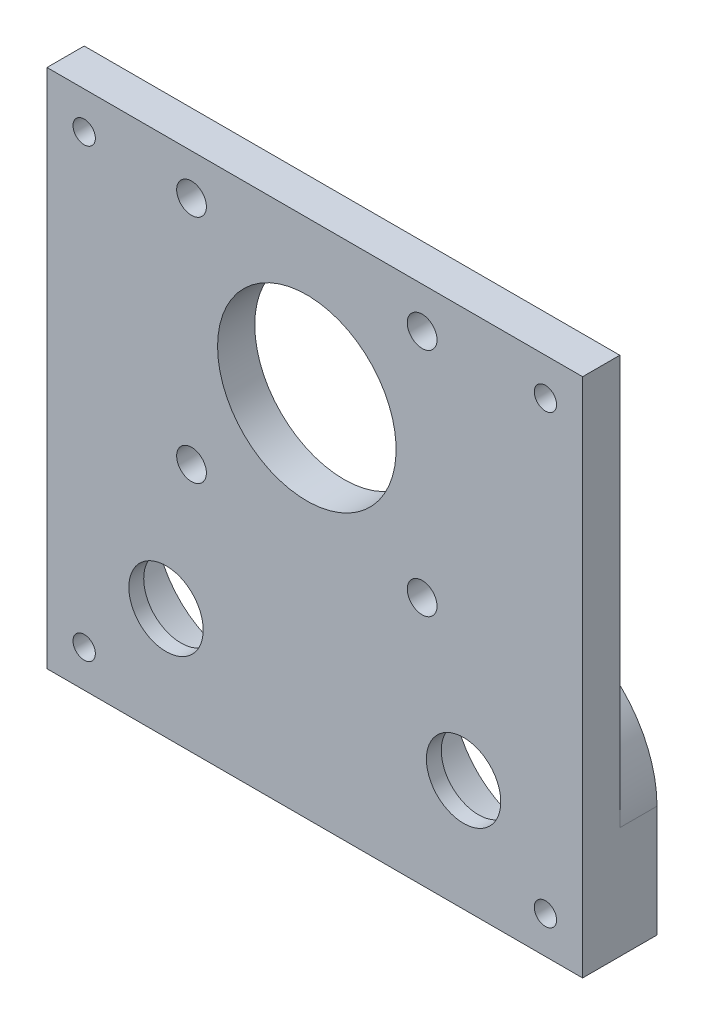
ISO-10303-21;
HEADER;
FILE_DESCRIPTION(('STEP AP214'),'2;1');
FILE_NAME('part.step','',(''),(''),'','','');
FILE_SCHEMA(('AUTOMOTIVE_DESIGN { 1 0 10303 214 1 1 1 1 }'));
ENDSEC;
DATA;
#1=APPLICATION_CONTEXT('core data for automotive mechanical design processes');
#2=APPLICATION_PROTOCOL_DEFINITION('international standard','automotive_design',2000,#1);
#3=PRODUCT_CONTEXT('',#1,'mechanical');
#4=PRODUCT('Part','Part','',(#3));
#5=PRODUCT_RELATED_PRODUCT_CATEGORY('part','',(#4));
#6=PRODUCT_DEFINITION_FORMATION('','',#4);
#7=PRODUCT_DEFINITION_CONTEXT('part definition',#1,'design');
#8=PRODUCT_DEFINITION('design','',#6,#7);
#9=PRODUCT_DEFINITION_SHAPE('','',#8);
#10=(LENGTH_UNIT() NAMED_UNIT(*) SI_UNIT(.MILLI.,.METRE.));
#11=(NAMED_UNIT(*) PLANE_ANGLE_UNIT() SI_UNIT($,.RADIAN.));
#12=(NAMED_UNIT(*) SI_UNIT($,.STERADIAN.) SOLID_ANGLE_UNIT());
#13=UNCERTAINTY_MEASURE_WITH_UNIT(LENGTH_MEASURE(1.E-05),#10,'distance_accuracy_value','');
#14=(GEOMETRIC_REPRESENTATION_CONTEXT(3) GLOBAL_UNCERTAINTY_ASSIGNED_CONTEXT((#13)) GLOBAL_UNIT_ASSIGNED_CONTEXT((#10,
#11,#12)) REPRESENTATION_CONTEXT('',''));
#15=CARTESIAN_POINT('',(0.,0.,0.));
#16=DIRECTION('',(0.,0.,1.));
#17=DIRECTION('',(1.,0.,0.));
#18=AXIS2_PLACEMENT_3D('',#15,#16,#17);
#19=CARTESIAN_POINT('',(35.,49.,10.));
#20=DIRECTION('',(0.,0.,-1.));
#21=DIRECTION('',(-1.,0.,0.));
#22=AXIS2_PLACEMENT_3D('',#19,#20,#21);
#23=PLANE('',#22);
#24=CARTESIAN_POINT('',(33.9286924942945,49.,10.));
#25=DIRECTION('',(0.,0.,-1.));
#26=DIRECTION('',(-1.,0.,0.));
#27=AXIS2_PLACEMENT_3D('',#24,#25,#26);
#28=CIRCLE('',#27,12.);
#29=CARTESIAN_POINT('',(21.9286924942945,49.,10.));
#30=VERTEX_POINT('',#29);
#31=EDGE_CURVE('E40',#30,#30,#28,.T.);
#32=ORIENTED_EDGE('',*,*,#31,.T.);
#33=EDGE_LOOP('',(#32));
#34=FACE_BOUND('',#33,.T.);
#35=CARTESIAN_POINT('',(55.,15.,10.));
#36=DIRECTION('',(0.,0.,-1.));
#37=DIRECTION('',(-1.,0.,0.));
#38=AXIS2_PLACEMENT_3D('',#35,#36,#37);
#39=CIRCLE('',#38,5.);
#40=CARTESIAN_POINT('',(50.,15.,10.));
#41=VERTEX_POINT('',#40);
#42=EDGE_CURVE('E307',#41,#41,#39,.T.);
#43=ORIENTED_EDGE('',*,*,#42,.T.);
#44=EDGE_LOOP('',(#43));
#45=FACE_BOUND('',#44,.T.);
#46=CARTESIAN_POINT('',(15.,15.,10.));
#47=DIRECTION('',(0.,0.,-1.));
#48=DIRECTION('',(-1.,0.,0.));
#49=AXIS2_PLACEMENT_3D('',#46,#47,#48);
#50=CIRCLE('',#49,5.);
#51=CARTESIAN_POINT('',(10.,15.,10.));
#52=VERTEX_POINT('',#51);
#53=EDGE_CURVE('E192',#52,#52,#50,.T.);
#54=ORIENTED_EDGE('',*,*,#53,.T.);
#55=EDGE_LOOP('',(#54));
#56=FACE_BOUND('',#55,.T.);
#57=CARTESIAN_POINT('',(66.,5.,10.));
#58=DIRECTION('',(0.,0.,-1.));
#59=DIRECTION('',(-1.,0.,0.));
#60=AXIS2_PLACEMENT_3D('',#57,#58,#59);
#61=CIRCLE('',#60,1.5);
#62=CARTESIAN_POINT('',(64.5,5.,10.));
#63=VERTEX_POINT('',#62);
#64=EDGE_CURVE('E196',#63,#63,#61,.T.);
#65=ORIENTED_EDGE('',*,*,#64,.T.);
#66=EDGE_LOOP('',(#65));
#67=FACE_BOUND('',#66,.T.);
#68=CARTESIAN_POINT('',(4.,5.,10.));
#69=DIRECTION('',(0.,0.,-1.));
#70=DIRECTION('',(-1.,0.,0.));
#71=AXIS2_PLACEMENT_3D('',#68,#69,#70);
#72=CIRCLE('',#71,1.5);
#73=CARTESIAN_POINT('',(2.5,5.,10.));
#74=VERTEX_POINT('',#73);
#75=EDGE_CURVE('E197',#74,#74,#72,.T.);
#76=ORIENTED_EDGE('',*,*,#75,.T.);
#77=EDGE_LOOP('',(#76));
#78=FACE_BOUND('',#77,.T.);
#79=CARTESIAN_POINT('',(4.,65.,10.));
#80=DIRECTION('',(0.,0.,-1.));
#81=DIRECTION('',(-1.,0.,0.));
#82=AXIS2_PLACEMENT_3D('',#79,#80,#81);
#83=CIRCLE('',#82,1.5);
#84=CARTESIAN_POINT('',(2.5,65.,10.));
#85=VERTEX_POINT('',#84);
#86=EDGE_CURVE('E191',#85,#85,#83,.T.);
#87=ORIENTED_EDGE('',*,*,#86,.T.);
#88=EDGE_LOOP('',(#87));
#89=FACE_BOUND('',#88,.T.);
#90=CARTESIAN_POINT('',(66.,65.,10.));
#91=DIRECTION('',(0.,0.,-1.));
#92=DIRECTION('',(-1.,0.,0.));
#93=AXIS2_PLACEMENT_3D('',#90,#91,#92);
#94=CIRCLE('',#93,1.5);
#95=CARTESIAN_POINT('',(64.5,65.,10.));
#96=VERTEX_POINT('',#95);
#97=EDGE_CURVE('E186',#96,#96,#94,.T.);
#98=ORIENTED_EDGE('',*,*,#97,.T.);
#99=EDGE_LOOP('',(#98));
#100=FACE_BOUND('',#99,.T.);
#101=CARTESIAN_POINT('',(49.4286924942945,33.5,10.));
#102=DIRECTION('',(0.,0.,-1.));
#103=DIRECTION('',(-1.,0.,0.));
#104=AXIS2_PLACEMENT_3D('',#101,#102,#103);
#105=CIRCLE('',#104,2.);
#106=CARTESIAN_POINT('',(47.4286924942945,33.5,10.));
#107=VERTEX_POINT('',#106);
#108=EDGE_CURVE('E149',#107,#107,#105,.T.);
#109=ORIENTED_EDGE('',*,*,#108,.T.);
#110=EDGE_LOOP('',(#109));
#111=FACE_BOUND('',#110,.T.);
#112=CARTESIAN_POINT('',(18.4286924942945,33.5,10.));
#113=DIRECTION('',(0.,0.,-1.));
#114=DIRECTION('',(-1.,0.,0.));
#115=AXIS2_PLACEMENT_3D('',#112,#113,#114);
#116=CIRCLE('',#115,2.);
#117=CARTESIAN_POINT('',(16.4286924942945,33.5,10.));
#118=VERTEX_POINT('',#117);
#119=EDGE_CURVE('E153',#118,#118,#116,.T.);
#120=ORIENTED_EDGE('',*,*,#119,.T.);
#121=EDGE_LOOP('',(#120));
#122=FACE_BOUND('',#121,.T.);
#123=CARTESIAN_POINT('',(18.4286924942945,64.5,10.));
#124=DIRECTION('',(0.,0.,-1.));
#125=DIRECTION('',(-1.,0.,0.));
#126=AXIS2_PLACEMENT_3D('',#123,#124,#125);
#127=CIRCLE('',#126,2.);
#128=CARTESIAN_POINT('',(16.4286924942945,64.5,10.));
#129=VERTEX_POINT('',#128);
#130=EDGE_CURVE('E148',#129,#129,#127,.T.);
#131=ORIENTED_EDGE('',*,*,#130,.T.);
#132=EDGE_LOOP('',(#131));
#133=FACE_BOUND('',#132,.T.);
#134=CARTESIAN_POINT('',(49.4286924942945,64.5,10.));
#135=DIRECTION('',(0.,0.,-1.));
#136=DIRECTION('',(-1.,0.,0.));
#137=AXIS2_PLACEMENT_3D('',#134,#135,#136);
#138=CIRCLE('',#137,2.);
#139=CARTESIAN_POINT('',(47.4286924942945,64.5,10.));
#140=VERTEX_POINT('',#139);
#141=EDGE_CURVE('E152',#140,#140,#138,.T.);
#142=ORIENTED_EDGE('',*,*,#141,.T.);
#143=EDGE_LOOP('',(#142));
#144=FACE_BOUND('',#143,.T.);
#145=DIRECTION('',(-1.,0.,0.));
#146=VECTOR('',#145,1.);
#147=CARTESIAN_POINT('',(0.,70.,10.));
#148=LINE('',#147,#146);
#149=CARTESIAN_POINT('',(71.,70.,10.));
#150=VERTEX_POINT('',#149);
#151=CARTESIAN_POINT('',(-1.,70.,10.));
#152=VERTEX_POINT('',#151);
#153=EDGE_CURVE('E170',#150,#152,#148,.T.);
#154=ORIENTED_EDGE('',*,*,#153,.T.);
#155=DIRECTION('',(0.,-1.,0.));
#156=VECTOR('',#155,1.);
#157=CARTESIAN_POINT('',(-1.,0.,10.));
#158=LINE('',#157,#156);
#159=CARTESIAN_POINT('',(-1.,0.,10.));
#160=VERTEX_POINT('',#159);
#161=EDGE_CURVE('E324',#152,#160,#158,.T.);
#162=ORIENTED_EDGE('',*,*,#161,.T.);
#163=DIRECTION('',(1.,0.,0.));
#164=VECTOR('',#163,1.);
#165=CARTESIAN_POINT('',(0.,0.,10.));
#166=LINE('',#165,#164);
#167=CARTESIAN_POINT('',(71.,0.,10.));
#168=VERTEX_POINT('',#167);
#169=EDGE_CURVE('E167',#160,#168,#166,.T.);
#170=ORIENTED_EDGE('',*,*,#169,.T.);
#171=DIRECTION('',(0.,1.,0.));
#172=VECTOR('',#171,1.);
#173=CARTESIAN_POINT('',(71.,0.,10.));
#174=LINE('',#173,#172);
#175=EDGE_CURVE('E331',#168,#150,#174,.T.);
#176=ORIENTED_EDGE('',*,*,#175,.T.);
#177=EDGE_LOOP('',(#154,#162,#170,#176));
#178=FACE_BOUND('',#177,.T.);
#179=ADVANCED_FACE('F32',(#34,#45,#56,#67,#78,#89,#100,#111,#122,#133,#144,#178),#23,.F.);
#180=CARTESIAN_POINT('',(33.9286924942945,49.,10.));
#181=DIRECTION('',(0.,0.,-1.));
#182=DIRECTION('',(-1.,0.,0.));
#183=AXIS2_PLACEMENT_3D('',#180,#181,#182);
#184=CYLINDRICAL_SURFACE('',#183,12.);
#185=CARTESIAN_POINT('',(33.9286924942945,49.,5.));
#186=DIRECTION('',(0.,0.,1.));
#187=DIRECTION('',(1.,0.,0.));
#188=AXIS2_PLACEMENT_3D('',#185,#186,#187);
#189=CIRCLE('',#188,12.);
#190=CARTESIAN_POINT('',(45.9286924942945,49.,5.));
#191=VERTEX_POINT('',#190);
#192=EDGE_CURVE('E11',#191,#191,#189,.F.);
#193=ORIENTED_EDGE('',*,*,#192,.T.);
#194=EDGE_LOOP('',(#193));
#195=FACE_BOUND('',#194,.T.);
#196=ORIENTED_EDGE('',*,*,#31,.F.);
#197=EDGE_LOOP('',(#196));
#198=FACE_BOUND('',#197,.T.);
#199=ADVANCED_FACE('F204',(#195,#198),#184,.F.);
#200=CARTESIAN_POINT('',(15.,15.,5.));
#201=DIRECTION('',(0.,0.,1.));
#202=DIRECTION('',(1.,0.,0.));
#203=AXIS2_PLACEMENT_3D('',#200,#201,#202);
#204=PLANE('',#203);
#205=ORIENTED_EDGE('',*,*,#192,.F.);
#206=EDGE_LOOP('',(#205));
#207=FACE_BOUND('',#206,.T.);
#208=CARTESIAN_POINT('',(4.,65.,5.));
#209=DIRECTION('',(0.,0.,1.));
#210=DIRECTION('',(1.,0.,0.));
#211=AXIS2_PLACEMENT_3D('',#208,#209,#210);
#212=CIRCLE('',#211,1.5);
#213=CARTESIAN_POINT('',(5.5,65.,5.));
#214=VERTEX_POINT('',#213);
#215=EDGE_CURVE('E188',#214,#214,#212,.T.);
#216=ORIENTED_EDGE('',*,*,#215,.T.);
#217=EDGE_LOOP('',(#216));
#218=FACE_BOUND('',#217,.T.);
#219=CARTESIAN_POINT('',(66.,65.,5.));
#220=DIRECTION('',(0.,0.,1.));
#221=DIRECTION('',(1.,0.,0.));
#222=AXIS2_PLACEMENT_3D('',#219,#220,#221);
#223=CIRCLE('',#222,1.5);
#224=CARTESIAN_POINT('',(67.5,65.,5.));
#225=VERTEX_POINT('',#224);
#226=EDGE_CURVE('E183',#225,#225,#223,.T.);
#227=ORIENTED_EDGE('',*,*,#226,.T.);
#228=EDGE_LOOP('',(#227));
#229=FACE_BOUND('',#228,.T.);
#230=CARTESIAN_POINT('',(18.4286924942945,64.5,5.));
#231=DIRECTION('',(0.,0.,1.));
#232=DIRECTION('',(1.,0.,0.));
#233=AXIS2_PLACEMENT_3D('',#230,#231,#232);
#234=CIRCLE('',#233,2.);
#235=CARTESIAN_POINT('',(20.4286924942945,64.5,5.));
#236=VERTEX_POINT('',#235);
#237=EDGE_CURVE('E142',#236,#236,#234,.F.);
#238=ORIENTED_EDGE('',*,*,#237,.F.);
#239=EDGE_LOOP('',(#238));
#240=FACE_BOUND('',#239,.T.);
#241=CARTESIAN_POINT('',(49.4286924942945,33.5,5.));
#242=DIRECTION('',(0.,0.,1.));
#243=DIRECTION('',(1.,0.,0.));
#244=AXIS2_PLACEMENT_3D('',#241,#242,#243);
#245=CIRCLE('',#244,2.);
#246=CARTESIAN_POINT('',(51.4286924942945,33.5,5.));
#247=VERTEX_POINT('',#246);
#248=EDGE_CURVE('E138',#247,#247,#245,.F.);
#249=ORIENTED_EDGE('',*,*,#248,.F.);
#250=EDGE_LOOP('',(#249));
#251=FACE_BOUND('',#250,.T.);
#252=CARTESIAN_POINT('',(15.,15.,5.));
#253=DIRECTION('',(0.,0.,1.));
#254=DIRECTION('',(1.,0.,0.));
#255=AXIS2_PLACEMENT_3D('',#252,#253,#254);
#256=CIRCLE('',#255,16.);
#257=CARTESIAN_POINT('',(31.,15.,5.));
#258=VERTEX_POINT('',#257);
#259=CARTESIAN_POINT('',(-1.,15.,5.));
#260=VERTEX_POINT('',#259);
#261=EDGE_CURVE('E111',#258,#260,#256,.T.);
#262=ORIENTED_EDGE('',*,*,#261,.T.);
#263=DIRECTION('',(0.,-1.,0.));
#264=VECTOR('',#263,1.);
#265=CARTESIAN_POINT('',(-1.,0.,5.));
#266=LINE('',#265,#264);
#267=CARTESIAN_POINT('',(-1.,70.,5.));
#268=VERTEX_POINT('',#267);
#269=EDGE_CURVE('E90',#268,#260,#266,.T.);
#270=ORIENTED_EDGE('',*,*,#269,.F.);
#271=DIRECTION('',(-1.,0.,0.));
#272=VECTOR('',#271,1.);
#273=CARTESIAN_POINT('',(85.,70.,5.));
#274=LINE('',#273,#272);
#275=CARTESIAN_POINT('',(71.,70.,5.));
#276=VERTEX_POINT('',#275);
#277=EDGE_CURVE('E340',#276,#268,#274,.T.);
#278=ORIENTED_EDGE('',*,*,#277,.F.);
#279=DIRECTION('',(0.,1.,0.));
#280=VECTOR('',#279,1.);
#281=CARTESIAN_POINT('',(71.,0.,5.));
#282=LINE('',#281,#280);
#283=CARTESIAN_POINT('',(71.,15.,5.));
#284=VERTEX_POINT('',#283);
#285=EDGE_CURVE('E330',#284,#276,#282,.T.);
#286=ORIENTED_EDGE('',*,*,#285,.F.);
#287=CARTESIAN_POINT('',(55.,15.,5.));
#288=DIRECTION('',(0.,0.,-1.));
#289=DIRECTION('',(-1.,0.,0.));
#290=AXIS2_PLACEMENT_3D('',#287,#288,#289);
#291=CIRCLE('',#290,16.);
#292=CARTESIAN_POINT('',(39.,15.,5.));
#293=VERTEX_POINT('',#292);
#294=EDGE_CURVE('E346',#293,#284,#291,.T.);
#295=ORIENTED_EDGE('',*,*,#294,.F.);
#296=DIRECTION('',(0.,-1.,0.));
#297=VECTOR('',#296,1.);
#298=CARTESIAN_POINT('',(39.,15.,5.));
#299=LINE('',#298,#297);
#300=CARTESIAN_POINT('',(39.,0.,5.));
#301=VERTEX_POINT('',#300);
#302=EDGE_CURVE('E118',#293,#301,#299,.T.);
#303=ORIENTED_EDGE('',*,*,#302,.T.);
#304=DIRECTION('',(-1.,0.,0.));
#305=VECTOR('',#304,1.);
#306=CARTESIAN_POINT('',(39.,0.,5.));
#307=LINE('',#306,#305);
#308=CARTESIAN_POINT('',(31.,0.,5.));
#309=VERTEX_POINT('',#308);
#310=EDGE_CURVE('E110',#301,#309,#307,.T.);
#311=ORIENTED_EDGE('',*,*,#310,.T.);
#312=DIRECTION('',(0.,1.,0.));
#313=VECTOR('',#312,1.);
#314=CARTESIAN_POINT('',(31.,0.,5.));
#315=LINE('',#314,#313);
#316=EDGE_CURVE('E99',#309,#258,#315,.T.);
#317=ORIENTED_EDGE('',*,*,#316,.T.);
#318=EDGE_LOOP('',(#262,#270,#278,#286,#295,#303,#311,#317));
#319=FACE_BOUND('',#318,.T.);
#320=CARTESIAN_POINT('',(18.4286924942945,33.5,5.));
#321=DIRECTION('',(0.,0.,1.));
#322=DIRECTION('',(1.,0.,0.));
#323=AXIS2_PLACEMENT_3D('',#320,#321,#322);
#324=CIRCLE('',#323,2.);
#325=CARTESIAN_POINT('',(20.4286924942945,33.5,5.));
#326=VERTEX_POINT('',#325);
#327=EDGE_CURVE('E139',#326,#326,#324,.F.);
#328=ORIENTED_EDGE('',*,*,#327,.F.);
#329=EDGE_LOOP('',(#328));
#330=FACE_BOUND('',#329,.T.);
#331=CARTESIAN_POINT('',(49.4286924942945,64.5,5.));
#332=DIRECTION('',(0.,0.,1.));
#333=DIRECTION('',(1.,0.,0.));
#334=AXIS2_PLACEMENT_3D('',#331,#332,#333);
#335=CIRCLE('',#334,2.);
#336=CARTESIAN_POINT('',(51.4286924942945,64.5,5.));
#337=VERTEX_POINT('',#336);
#338=EDGE_CURVE('E145',#337,#337,#335,.F.);
#339=ORIENTED_EDGE('',*,*,#338,.F.);
#340=EDGE_LOOP('',(#339));
#341=FACE_BOUND('',#340,.T.);
#342=ADVANCED_FACE('F115',(#207,#218,#229,#240,#251,#319,#330,#341),#204,.F.);
#343=CARTESIAN_POINT('',(0.,0.,10.));
#344=DIRECTION('',(0.,1.,0.));
#345=DIRECTION('',(0.,0.,1.));
#346=AXIS2_PLACEMENT_3D('',#343,#344,#345);
#347=PLANE('',#346);
#348=ORIENTED_EDGE('',*,*,#169,.F.);
#349=DIRECTION('',(0.,0.,-1.));
#350=VECTOR('',#349,1.);
#351=CARTESIAN_POINT('',(-1.,0.,5.));
#352=LINE('',#351,#350);
#353=CARTESIAN_POINT('',(-1.,0.,0.));
#354=VERTEX_POINT('',#353);
#355=EDGE_CURVE('E136',#160,#354,#352,.T.);
#356=ORIENTED_EDGE('',*,*,#355,.T.);
#357=DIRECTION('',(1.,0.,0.));
#358=VECTOR('',#357,1.);
#359=CARTESIAN_POINT('',(0.,0.,0.));
#360=LINE('',#359,#358);
#361=CARTESIAN_POINT('',(31.,0.,0.));
#362=VERTEX_POINT('',#361);
#363=EDGE_CURVE('E127',#354,#362,#360,.T.);
#364=ORIENTED_EDGE('',*,*,#363,.T.);
#365=DIRECTION('',(0.,0.,-1.));
#366=VECTOR('',#365,1.);
#367=CARTESIAN_POINT('',(31.,0.,5.));
#368=LINE('',#367,#366);
#369=EDGE_CURVE('E104',#309,#362,#368,.T.);
#370=ORIENTED_EDGE('',*,*,#369,.F.);
#371=ORIENTED_EDGE('',*,*,#310,.F.);
#372=DIRECTION('',(0.,0.,-1.));
#373=VECTOR('',#372,1.);
#374=CARTESIAN_POINT('',(39.,0.,5.));
#375=LINE('',#374,#373);
#376=CARTESIAN_POINT('',(39.,0.,0.));
#377=VERTEX_POINT('',#376);
#378=EDGE_CURVE('E128',#301,#377,#375,.T.);
#379=ORIENTED_EDGE('',*,*,#378,.T.);
#380=CARTESIAN_POINT('',(71.,0.,0.));
#381=VERTEX_POINT('',#380);
#382=EDGE_CURVE('E164',#377,#381,#360,.T.);
#383=ORIENTED_EDGE('',*,*,#382,.T.);
#384=DIRECTION('',(0.,0.,-1.));
#385=VECTOR('',#384,1.);
#386=CARTESIAN_POINT('',(71.,0.,5.));
#387=LINE('',#386,#385);
#388=EDGE_CURVE('E82',#168,#381,#387,.T.);
#389=ORIENTED_EDGE('',*,*,#388,.F.);
#390=EDGE_LOOP('',(#348,#356,#364,#370,#371,#379,#383,#389));
#391=FACE_BOUND('',#390,.T.);
#392=ADVANCED_FACE('F124',(#391),#347,.F.);
#393=CARTESIAN_POINT('',(0.,0.,0.));
#394=DIRECTION('',(0.,0.,-1.));
#395=DIRECTION('',(-1.,0.,0.));
#396=AXIS2_PLACEMENT_3D('',#393,#394,#395);
#397=PLANE('',#396);
#398=CARTESIAN_POINT('',(4.,5.,0.));
#399=DIRECTION('',(0.,0.,-1.));
#400=DIRECTION('',(-1.,0.,0.));
#401=AXIS2_PLACEMENT_3D('',#398,#399,#400);
#402=CIRCLE('',#401,1.5);
#403=CARTESIAN_POINT('',(2.5,5.,0.));
#404=VERTEX_POINT('',#403);
#405=EDGE_CURVE('E187',#404,#404,#402,.T.);
#406=ORIENTED_EDGE('',*,*,#405,.F.);
#407=EDGE_LOOP('',(#406));
#408=FACE_BOUND('',#407,.T.);
#409=DIRECTION('',(0.,-1.,0.));
#410=VECTOR('',#409,1.);
#411=CARTESIAN_POINT('',(-1.,15.,0.));
#412=LINE('',#411,#410);
#413=CARTESIAN_POINT('',(-1.,15.,0.));
#414=VERTEX_POINT('',#413);
#415=EDGE_CURVE('E339',#414,#354,#412,.T.);
#416=ORIENTED_EDGE('',*,*,#415,.F.);
#417=CARTESIAN_POINT('',(15.,15.,0.));
#418=DIRECTION('',(0.,0.,1.));
#419=DIRECTION('',(1.,0.,0.));
#420=AXIS2_PLACEMENT_3D('',#417,#418,#419);
#421=CIRCLE('',#420,16.);
#422=CARTESIAN_POINT('',(31.,15.,0.));
#423=VERTEX_POINT('',#422);
#424=EDGE_CURVE('E349',#423,#414,#421,.T.);
#425=ORIENTED_EDGE('',*,*,#424,.F.);
#426=DIRECTION('',(0.,1.,0.));
#427=VECTOR('',#426,1.);
#428=CARTESIAN_POINT('',(31.,0.,0.));
#429=LINE('',#428,#427);
#430=EDGE_CURVE('E352',#362,#423,#429,.T.);
#431=ORIENTED_EDGE('',*,*,#430,.F.);
#432=ORIENTED_EDGE('',*,*,#363,.F.);
#433=EDGE_LOOP('',(#416,#425,#431,#432));
#434=FACE_BOUND('',#433,.T.);
#435=CARTESIAN_POINT('',(15.,15.,0.));
#436=DIRECTION('',(0.,0.,1.));
#437=DIRECTION('',(1.,0.,0.));
#438=AXIS2_PLACEMENT_3D('',#435,#436,#437);
#439=CIRCLE('',#438,11.5);
#440=CARTESIAN_POINT('',(26.5,15.,0.));
#441=VERTEX_POINT('',#440);
#442=EDGE_CURVE('E161',#441,#441,#439,.T.);
#443=ORIENTED_EDGE('',*,*,#442,.T.);
#444=EDGE_LOOP('',(#443));
#445=FACE_BOUND('',#444,.T.);
#446=ADVANCED_FACE('F216',(#408,#434,#445),#397,.T.);
#447=CARTESIAN_POINT('',(55.,15.,0.));
#448=DIRECTION('',(0.,0.,1.));
#449=DIRECTION('',(1.,0.,0.));
#450=AXIS2_PLACEMENT_3D('',#447,#448,#449);
#451=CYLINDRICAL_SURFACE('',#450,11.5);
#452=CARTESIAN_POINT('',(55.,15.,0.));
#453=DIRECTION('',(0.,0.,1.));
#454=DIRECTION('',(1.,0.,0.));
#455=AXIS2_PLACEMENT_3D('',#452,#453,#454);
#456=CIRCLE('',#455,11.5);
#457=CARTESIAN_POINT('',(66.5,15.,0.));
#458=VERTEX_POINT('',#457);
#459=EDGE_CURVE('E160',#458,#458,#456,.T.);
#460=ORIENTED_EDGE('',*,*,#459,.F.);
#461=EDGE_LOOP('',(#460));
#462=FACE_BOUND('',#461,.T.);
#463=CARTESIAN_POINT('',(55.,15.,8.));
#464=DIRECTION('',(0.,0.,1.));
#465=DIRECTION('',(1.,0.,0.));
#466=AXIS2_PLACEMENT_3D('',#463,#464,#465);
#467=CIRCLE('',#466,11.5);
#468=CARTESIAN_POINT('',(66.5,15.,8.));
#469=VERTEX_POINT('',#468);
#470=EDGE_CURVE('E178',#469,#469,#467,.F.);
#471=ORIENTED_EDGE('',*,*,#470,.F.);
#472=EDGE_LOOP('',(#471));
#473=FACE_BOUND('',#472,.T.);
#474=ADVANCED_FACE('F227',(#462,#473),#451,.F.);
#475=CARTESIAN_POINT('',(15.,15.,0.));
#476=DIRECTION('',(0.,0.,1.));
#477=DIRECTION('',(1.,0.,0.));
#478=AXIS2_PLACEMENT_3D('',#475,#476,#477);
#479=CYLINDRICAL_SURFACE('',#478,11.5);
#480=ORIENTED_EDGE('',*,*,#442,.F.);
#481=EDGE_LOOP('',(#480));
#482=FACE_BOUND('',#481,.T.);
#483=CARTESIAN_POINT('',(15.,15.,8.));
#484=DIRECTION('',(0.,0.,1.));
#485=DIRECTION('',(1.,0.,0.));
#486=AXIS2_PLACEMENT_3D('',#483,#484,#485);
#487=CIRCLE('',#486,11.5);
#488=CARTESIAN_POINT('',(26.5,15.,8.));
#489=VERTEX_POINT('',#488);
#490=EDGE_CURVE('E173',#489,#489,#487,.F.);
#491=ORIENTED_EDGE('',*,*,#490,.F.);
#492=EDGE_LOOP('',(#491));
#493=FACE_BOUND('',#492,.T.);
#494=ADVANCED_FACE('F221',(#482,#493),#479,.F.);
#495=CARTESIAN_POINT('',(0.,70.,10.));
#496=DIRECTION('',(0.,-1.,0.));
#497=DIRECTION('',(0.,0.,-1.));
#498=AXIS2_PLACEMENT_3D('',#495,#496,#497);
#499=PLANE('',#498);
#500=ORIENTED_EDGE('',*,*,#277,.T.);
#501=DIRECTION('',(0.,0.,-1.));
#502=VECTOR('',#501,1.);
#503=CARTESIAN_POINT('',(-1.,70.,10.));
#504=LINE('',#503,#502);
#505=EDGE_CURVE('E327',#152,#268,#504,.T.);
#506=ORIENTED_EDGE('',*,*,#505,.F.);
#507=ORIENTED_EDGE('',*,*,#153,.F.);
#508=DIRECTION('',(0.,0.,-1.));
#509=VECTOR('',#508,1.);
#510=CARTESIAN_POINT('',(71.,70.,10.));
#511=LINE('',#510,#509);
#512=EDGE_CURVE('E334',#150,#276,#511,.T.);
#513=ORIENTED_EDGE('',*,*,#512,.T.);
#514=EDGE_LOOP('',(#500,#506,#507,#513));
#515=FACE_BOUND('',#514,.T.);
#516=ADVANCED_FACE('F217',(#515),#499,.F.);
#517=CARTESIAN_POINT('',(66.,5.,0.));
#518=DIRECTION('',(0.,0.,-1.));
#519=DIRECTION('',(-1.,0.,0.));
#520=AXIS2_PLACEMENT_3D('',#517,#518,#519);
#521=CIRCLE('',#520,1.5);
#522=CARTESIAN_POINT('',(64.5,5.,0.));
#523=VERTEX_POINT('',#522);
#524=EDGE_CURVE('E193',#523,#523,#521,.T.);
#525=ORIENTED_EDGE('',*,*,#524,.F.);
#526=EDGE_LOOP('',(#525));
#527=FACE_BOUND('',#526,.T.);
#528=DIRECTION('',(0.,-1.,0.));
#529=VECTOR('',#528,1.);
#530=CARTESIAN_POINT('',(39.,15.,0.));
#531=LINE('',#530,#529);
#532=CARTESIAN_POINT('',(39.,15.,0.));
#533=VERTEX_POINT('',#532);
#534=EDGE_CURVE('E354',#533,#377,#531,.T.);
#535=ORIENTED_EDGE('',*,*,#534,.F.);
#536=CARTESIAN_POINT('',(55.,15.,0.));
#537=DIRECTION('',(0.,0.,-1.));
#538=DIRECTION('',(-1.,0.,0.));
#539=AXIS2_PLACEMENT_3D('',#536,#537,#538);
#540=CIRCLE('',#539,16.);
#541=CARTESIAN_POINT('',(71.,15.,0.));
#542=VERTEX_POINT('',#541);
#543=EDGE_CURVE('E356',#533,#542,#540,.T.);
#544=ORIENTED_EDGE('',*,*,#543,.T.);
#545=DIRECTION('',(0.,-1.,0.));
#546=VECTOR('',#545,1.);
#547=CARTESIAN_POINT('',(71.,15.,0.));
#548=LINE('',#547,#546);
#549=EDGE_CURVE('E343',#542,#381,#548,.T.);
#550=ORIENTED_EDGE('',*,*,#549,.T.);
#551=ORIENTED_EDGE('',*,*,#382,.F.);
#552=EDGE_LOOP('',(#535,#544,#550,#551));
#553=FACE_BOUND('',#552,.T.);
#554=ORIENTED_EDGE('',*,*,#459,.T.);
#555=EDGE_LOOP('',(#554));
#556=FACE_BOUND('',#555,.T.);
#557=ADVANCED_FACE('F220',(#527,#553,#556),#397,.T.);
#558=CARTESIAN_POINT('',(15.,15.,8.));
#559=DIRECTION('',(0.,0.,1.));
#560=DIRECTION('',(1.,0.,0.));
#561=AXIS2_PLACEMENT_3D('',#558,#559,#560);
#562=PLANE('',#561);
#563=CARTESIAN_POINT('',(15.,15.,8.));
#564=DIRECTION('',(0.,0.,-1.));
#565=DIRECTION('',(-1.,0.,0.));
#566=AXIS2_PLACEMENT_3D('',#563,#564,#565);
#567=CIRCLE('',#566,5.);
#568=CARTESIAN_POINT('',(10.,15.,8.));
#569=VERTEX_POINT('',#568);
#570=EDGE_CURVE('E308',#569,#569,#567,.T.);
#571=ORIENTED_EDGE('',*,*,#570,.F.);
#572=EDGE_LOOP('',(#571));
#573=FACE_BOUND('',#572,.T.);
#574=ORIENTED_EDGE('',*,*,#490,.T.);
#575=EDGE_LOOP('',(#574));
#576=FACE_BOUND('',#575,.T.);
#577=ADVANCED_FACE('F225',(#573,#576),#562,.F.);
#578=CARTESIAN_POINT('',(55.,15.,8.));
#579=DIRECTION('',(0.,0.,1.));
#580=DIRECTION('',(1.,0.,0.));
#581=AXIS2_PLACEMENT_3D('',#578,#579,#580);
#582=PLANE('',#581);
#583=CARTESIAN_POINT('',(55.,15.,8.));
#584=DIRECTION('',(0.,0.,-1.));
#585=DIRECTION('',(-1.,0.,0.));
#586=AXIS2_PLACEMENT_3D('',#583,#584,#585);
#587=CIRCLE('',#586,5.);
#588=CARTESIAN_POINT('',(50.,15.,8.));
#589=VERTEX_POINT('',#588);
#590=EDGE_CURVE('E304',#589,#589,#587,.T.);
#591=ORIENTED_EDGE('',*,*,#590,.F.);
#592=EDGE_LOOP('',(#591));
#593=FACE_BOUND('',#592,.T.);
#594=ORIENTED_EDGE('',*,*,#470,.T.);
#595=EDGE_LOOP('',(#594));
#596=FACE_BOUND('',#595,.T.);
#597=ADVANCED_FACE('F236',(#593,#596),#582,.F.);
#598=CARTESIAN_POINT('',(49.4286924942945,64.5,10.));
#599=DIRECTION('',(0.,0.,-1.));
#600=DIRECTION('',(-1.,0.,0.));
#601=AXIS2_PLACEMENT_3D('',#598,#599,#600);
#602=CYLINDRICAL_SURFACE('',#601,2.);
#603=ORIENTED_EDGE('',*,*,#338,.T.);
#604=EDGE_LOOP('',(#603));
#605=FACE_BOUND('',#604,.T.);
#606=ORIENTED_EDGE('',*,*,#141,.F.);
#607=EDGE_LOOP('',(#606));
#608=FACE_BOUND('',#607,.T.);
#609=ADVANCED_FACE('F240',(#605,#608),#602,.F.);
#610=CARTESIAN_POINT('',(18.4286924942945,64.5,10.));
#611=DIRECTION('',(0.,0.,-1.));
#612=DIRECTION('',(-1.,0.,0.));
#613=AXIS2_PLACEMENT_3D('',#610,#611,#612);
#614=CYLINDRICAL_SURFACE('',#613,2.);
#615=ORIENTED_EDGE('',*,*,#237,.T.);
#616=EDGE_LOOP('',(#615));
#617=FACE_BOUND('',#616,.T.);
#618=ORIENTED_EDGE('',*,*,#130,.F.);
#619=EDGE_LOOP('',(#618));
#620=FACE_BOUND('',#619,.T.);
#621=ADVANCED_FACE('F244',(#617,#620),#614,.F.);
#622=CARTESIAN_POINT('',(18.4286924942945,33.5,10.));
#623=DIRECTION('',(0.,0.,-1.));
#624=DIRECTION('',(-1.,0.,0.));
#625=AXIS2_PLACEMENT_3D('',#622,#623,#624);
#626=CYLINDRICAL_SURFACE('',#625,2.);
#627=ORIENTED_EDGE('',*,*,#327,.T.);
#628=EDGE_LOOP('',(#627));
#629=FACE_BOUND('',#628,.T.);
#630=ORIENTED_EDGE('',*,*,#119,.F.);
#631=EDGE_LOOP('',(#630));
#632=FACE_BOUND('',#631,.T.);
#633=ADVANCED_FACE('F248',(#629,#632),#626,.F.);
#634=CARTESIAN_POINT('',(49.4286924942945,33.5,10.));
#635=DIRECTION('',(0.,0.,-1.));
#636=DIRECTION('',(-1.,0.,0.));
#637=AXIS2_PLACEMENT_3D('',#634,#635,#636);
#638=CYLINDRICAL_SURFACE('',#637,2.);
#639=ORIENTED_EDGE('',*,*,#248,.T.);
#640=EDGE_LOOP('',(#639));
#641=FACE_BOUND('',#640,.T.);
#642=ORIENTED_EDGE('',*,*,#108,.F.);
#643=EDGE_LOOP('',(#642));
#644=FACE_BOUND('',#643,.T.);
#645=ADVANCED_FACE('F252',(#641,#644),#638,.F.);
#646=CARTESIAN_POINT('',(-1.,15.,5.));
#647=DIRECTION('',(1.,0.,0.));
#648=DIRECTION('',(0.,0.,-1.));
#649=AXIS2_PLACEMENT_3D('',#646,#647,#648);
#650=PLANE('',#649);
#651=ORIENTED_EDGE('',*,*,#415,.T.);
#652=ORIENTED_EDGE('',*,*,#355,.F.);
#653=ORIENTED_EDGE('',*,*,#161,.F.);
#654=ORIENTED_EDGE('',*,*,#505,.T.);
#655=ORIENTED_EDGE('',*,*,#269,.T.);
#656=DIRECTION('',(0.,0.,-1.));
#657=VECTOR('',#656,1.);
#658=CARTESIAN_POINT('',(-1.,15.,5.));
#659=LINE('',#658,#657);
#660=EDGE_CURVE('E130',#260,#414,#659,.T.);
#661=ORIENTED_EDGE('',*,*,#660,.T.);
#662=EDGE_LOOP('',(#651,#652,#653,#654,#655,#661));
#663=FACE_BOUND('',#662,.T.);
#664=ADVANCED_FACE('F256',(#663),#650,.F.);
#665=CARTESIAN_POINT('',(15.,15.,5.));
#666=DIRECTION('',(0.,0.,-1.));
#667=DIRECTION('',(-1.,0.,0.));
#668=AXIS2_PLACEMENT_3D('',#665,#666,#667);
#669=CYLINDRICAL_SURFACE('',#668,16.);
#670=ORIENTED_EDGE('',*,*,#424,.T.);
#671=ORIENTED_EDGE('',*,*,#660,.F.);
#672=ORIENTED_EDGE('',*,*,#261,.F.);
#673=DIRECTION('',(0.,0.,-1.));
#674=VECTOR('',#673,1.);
#675=CARTESIAN_POINT('',(31.,15.,5.));
#676=LINE('',#675,#674);
#677=EDGE_CURVE('E106',#258,#423,#676,.T.);
#678=ORIENTED_EDGE('',*,*,#677,.T.);
#679=EDGE_LOOP('',(#670,#671,#672,#678));
#680=FACE_BOUND('',#679,.T.);
#681=ADVANCED_FACE('F260',(#680),#669,.T.);
#682=CARTESIAN_POINT('',(31.,0.,5.));
#683=DIRECTION('',(-1.,0.,0.));
#684=DIRECTION('',(0.,0.,1.));
#685=AXIS2_PLACEMENT_3D('',#682,#683,#684);
#686=PLANE('',#685);
#687=ORIENTED_EDGE('',*,*,#430,.T.);
#688=ORIENTED_EDGE('',*,*,#677,.F.);
#689=ORIENTED_EDGE('',*,*,#316,.F.);
#690=ORIENTED_EDGE('',*,*,#369,.T.);
#691=EDGE_LOOP('',(#687,#688,#689,#690));
#692=FACE_BOUND('',#691,.T.);
#693=ADVANCED_FACE('F102',(#692),#686,.F.);
#694=CARTESIAN_POINT('',(39.,15.,5.));
#695=DIRECTION('',(1.,0.,0.));
#696=DIRECTION('',(0.,0.,-1.));
#697=AXIS2_PLACEMENT_3D('',#694,#695,#696);
#698=PLANE('',#697);
#699=ORIENTED_EDGE('',*,*,#534,.T.);
#700=ORIENTED_EDGE('',*,*,#378,.F.);
#701=ORIENTED_EDGE('',*,*,#302,.F.);
#702=DIRECTION('',(0.,0.,-1.));
#703=VECTOR('',#702,1.);
#704=CARTESIAN_POINT('',(39.,15.,5.));
#705=LINE('',#704,#703);
#706=EDGE_CURVE('E48',#293,#533,#705,.T.);
#707=ORIENTED_EDGE('',*,*,#706,.T.);
#708=EDGE_LOOP('',(#699,#700,#701,#707));
#709=FACE_BOUND('',#708,.T.);
#710=ADVANCED_FACE('F266',(#709),#698,.F.);
#711=CARTESIAN_POINT('',(55.,15.,5.));
#712=DIRECTION('',(0.,0.,-1.));
#713=DIRECTION('',(-1.,0.,0.));
#714=AXIS2_PLACEMENT_3D('',#711,#712,#713);
#715=CYLINDRICAL_SURFACE('',#714,16.);
#716=ORIENTED_EDGE('',*,*,#543,.F.);
#717=ORIENTED_EDGE('',*,*,#706,.F.);
#718=ORIENTED_EDGE('',*,*,#294,.T.);
#719=DIRECTION('',(0.,0.,-1.));
#720=VECTOR('',#719,1.);
#721=CARTESIAN_POINT('',(71.,15.,5.));
#722=LINE('',#721,#720);
#723=EDGE_CURVE('E75',#284,#542,#722,.T.);
#724=ORIENTED_EDGE('',*,*,#723,.T.);
#725=EDGE_LOOP('',(#716,#717,#718,#724));
#726=FACE_BOUND('',#725,.T.);
#727=ADVANCED_FACE('F269',(#726),#715,.T.);
#728=CARTESIAN_POINT('',(71.,15.,5.));
#729=DIRECTION('',(1.,0.,0.));
#730=DIRECTION('',(0.,0.,-1.));
#731=AXIS2_PLACEMENT_3D('',#728,#729,#730);
#732=PLANE('',#731);
#733=ORIENTED_EDGE('',*,*,#549,.F.);
#734=ORIENTED_EDGE('',*,*,#723,.F.);
#735=ORIENTED_EDGE('',*,*,#285,.T.);
#736=ORIENTED_EDGE('',*,*,#512,.F.);
#737=ORIENTED_EDGE('',*,*,#175,.F.);
#738=ORIENTED_EDGE('',*,*,#388,.T.);
#739=EDGE_LOOP('',(#733,#734,#735,#736,#737,#738));
#740=FACE_BOUND('',#739,.T.);
#741=ADVANCED_FACE('F273',(#740),#732,.T.);
#742=CARTESIAN_POINT('',(66.,65.,53.));
#743=DIRECTION('',(0.,0.,-1.));
#744=DIRECTION('',(-1.,0.,0.));
#745=AXIS2_PLACEMENT_3D('',#742,#743,#744);
#746=CYLINDRICAL_SURFACE('',#745,1.5);
#747=ORIENTED_EDGE('',*,*,#226,.F.);
#748=EDGE_LOOP('',(#747));
#749=FACE_BOUND('',#748,.T.);
#750=ORIENTED_EDGE('',*,*,#97,.F.);
#751=EDGE_LOOP('',(#750));
#752=FACE_BOUND('',#751,.T.);
#753=ADVANCED_FACE('F276',(#749,#752),#746,.F.);
#754=CARTESIAN_POINT('',(4.,65.,53.));
#755=DIRECTION('',(0.,0.,-1.));
#756=DIRECTION('',(-1.,0.,0.));
#757=AXIS2_PLACEMENT_3D('',#754,#755,#756);
#758=CYLINDRICAL_SURFACE('',#757,1.5);
#759=ORIENTED_EDGE('',*,*,#215,.F.);
#760=EDGE_LOOP('',(#759));
#761=FACE_BOUND('',#760,.T.);
#762=ORIENTED_EDGE('',*,*,#86,.F.);
#763=EDGE_LOOP('',(#762));
#764=FACE_BOUND('',#763,.T.);
#765=ADVANCED_FACE('F279',(#761,#764),#758,.F.);
#766=CARTESIAN_POINT('',(66.,5.,53.));
#767=DIRECTION('',(0.,0.,-1.));
#768=DIRECTION('',(-1.,0.,0.));
#769=AXIS2_PLACEMENT_3D('',#766,#767,#768);
#770=CYLINDRICAL_SURFACE('',#769,1.5);
#771=ORIENTED_EDGE('',*,*,#524,.T.);
#772=EDGE_LOOP('',(#771));
#773=FACE_BOUND('',#772,.T.);
#774=ORIENTED_EDGE('',*,*,#64,.F.);
#775=EDGE_LOOP('',(#774));
#776=FACE_BOUND('',#775,.T.);
#777=ADVANCED_FACE('F283',(#773,#776),#770,.F.);
#778=CARTESIAN_POINT('',(4.,5.,53.));
#779=DIRECTION('',(0.,0.,-1.));
#780=DIRECTION('',(-1.,0.,0.));
#781=AXIS2_PLACEMENT_3D('',#778,#779,#780);
#782=CYLINDRICAL_SURFACE('',#781,1.5);
#783=ORIENTED_EDGE('',*,*,#405,.T.);
#784=EDGE_LOOP('',(#783));
#785=FACE_BOUND('',#784,.T.);
#786=ORIENTED_EDGE('',*,*,#75,.F.);
#787=EDGE_LOOP('',(#786));
#788=FACE_BOUND('',#787,.T.);
#789=ADVANCED_FACE('F285',(#785,#788),#782,.F.);
#790=CARTESIAN_POINT('',(15.,15.,27.));
#791=DIRECTION('',(0.,0.,-1.));
#792=DIRECTION('',(-1.,0.,0.));
#793=AXIS2_PLACEMENT_3D('',#790,#791,#792);
#794=CYLINDRICAL_SURFACE('',#793,5.);
#795=ORIENTED_EDGE('',*,*,#570,.T.);
#796=EDGE_LOOP('',(#795));
#797=FACE_BOUND('',#796,.T.);
#798=ORIENTED_EDGE('',*,*,#53,.F.);
#799=EDGE_LOOP('',(#798));
#800=FACE_BOUND('',#799,.T.);
#801=ADVANCED_FACE('F288',(#797,#800),#794,.F.);
#802=CARTESIAN_POINT('',(55.,15.,27.));
#803=DIRECTION('',(0.,0.,-1.));
#804=DIRECTION('',(-1.,0.,0.));
#805=AXIS2_PLACEMENT_3D('',#802,#803,#804);
#806=CYLINDRICAL_SURFACE('',#805,5.);
#807=ORIENTED_EDGE('',*,*,#590,.T.);
#808=EDGE_LOOP('',(#807));
#809=FACE_BOUND('',#808,.T.);
#810=ORIENTED_EDGE('',*,*,#42,.F.);
#811=EDGE_LOOP('',(#810));
#812=FACE_BOUND('',#811,.T.);
#813=ADVANCED_FACE('F295',(#809,#812),#806,.F.);
#814=CLOSED_SHELL('',(#179,#199,#342,#392,#446,#474,#494,#516,#557,#577,#597,#609,#621,#633,
#645,#664,#681,#693,#710,#727,#741,#753,#765,#777,#789,#801,#813));
#815=MANIFOLD_SOLID_BREP('B2',#814);
#816=ADVANCED_BREP_SHAPE_REPRESENTATION('',(#18,#815),#14);
#817=SHAPE_DEFINITION_REPRESENTATION(#9,#816);
ENDSEC;
END-ISO-10303-21;
